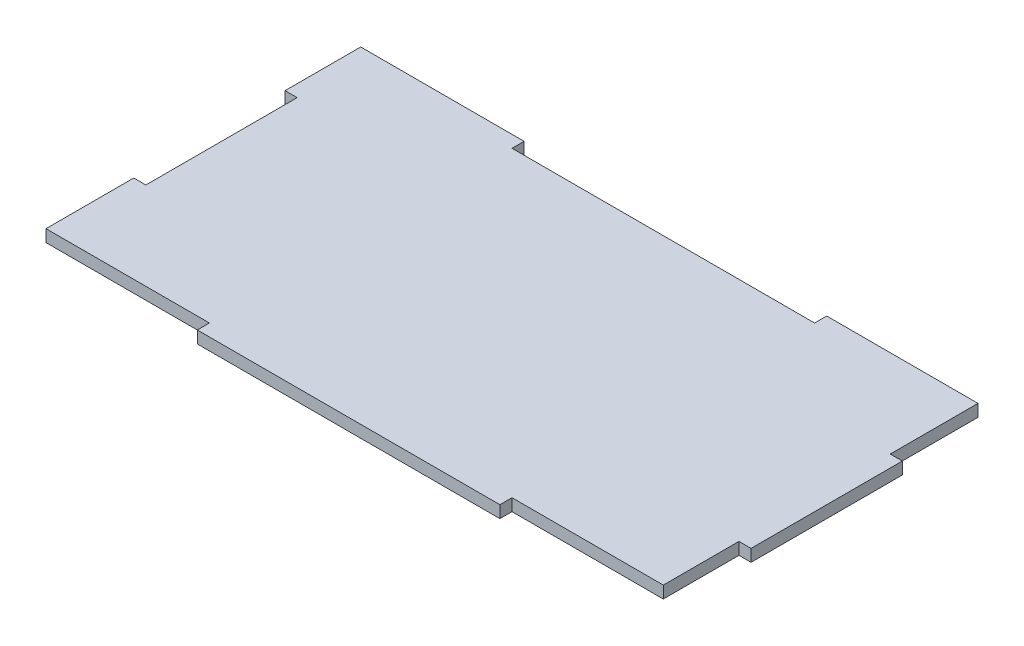
ISO-10303-21;
HEADER;
FILE_DESCRIPTION(('STEP AP214'),'2;1');
FILE_NAME('part.step','',(''),(''),'','','');
FILE_SCHEMA(('AUTOMOTIVE_DESIGN { 1 0 10303 214 1 1 1 1 }'));
ENDSEC;
DATA;
#1=APPLICATION_CONTEXT('core data for automotive mechanical design processes');
#2=APPLICATION_PROTOCOL_DEFINITION('international standard','automotive_design',2000,#1);
#3=PRODUCT_CONTEXT('',#1,'mechanical');
#4=PRODUCT('Part','Part','',(#3));
#5=PRODUCT_RELATED_PRODUCT_CATEGORY('part','',(#4));
#6=PRODUCT_DEFINITION_FORMATION('','',#4);
#7=PRODUCT_DEFINITION_CONTEXT('part definition',#1,'design');
#8=PRODUCT_DEFINITION('design','',#6,#7);
#9=PRODUCT_DEFINITION_SHAPE('','',#8);
#10=(LENGTH_UNIT() NAMED_UNIT(*) SI_UNIT(.MILLI.,.METRE.));
#11=(NAMED_UNIT(*) PLANE_ANGLE_UNIT() SI_UNIT($,.RADIAN.));
#12=(NAMED_UNIT(*) SI_UNIT($,.STERADIAN.) SOLID_ANGLE_UNIT());
#13=UNCERTAINTY_MEASURE_WITH_UNIT(LENGTH_MEASURE(1.E-05),#10,'distance_accuracy_value','');
#14=(GEOMETRIC_REPRESENTATION_CONTEXT(3) GLOBAL_UNCERTAINTY_ASSIGNED_CONTEXT((#13)) GLOBAL_UNIT_ASSIGNED_CONTEXT((#10,
#11,#12)) REPRESENTATION_CONTEXT('',''));
#15=CARTESIAN_POINT('',(0.,0.,0.));
#16=DIRECTION('',(0.,0.,1.));
#17=DIRECTION('',(1.,0.,0.));
#18=AXIS2_PLACEMENT_3D('',#15,#16,#17);
#19=CARTESIAN_POINT('',(34.2610885978316,4.,-40.2512712956719));
#20=DIRECTION('',(0.,0.,1.));
#21=DIRECTION('',(1.,0.,0.));
#22=AXIS2_PLACEMENT_3D('',#19,#20,#21);
#23=PLANE('',#22);
#24=DIRECTION('',(-1.,0.,0.));
#25=VECTOR('',#24,1.);
#26=CARTESIAN_POINT('',(34.2610885978316,0.,-40.2512712956719));
#27=LINE('',#26,#25);
#28=CARTESIAN_POINT('',(34.2610885978316,0.,-40.2512712956719));
#29=VERTEX_POINT('',#28);
#30=CARTESIAN_POINT('',(-65.7389114021684,0.,-40.2512712956719));
#31=VERTEX_POINT('',#30);
#32=EDGE_CURVE('E222',#29,#31,#27,.T.);
#33=ORIENTED_EDGE('',*,*,#32,.T.);
#34=DIRECTION('',(0.,-1.,0.));
#35=VECTOR('',#34,1.);
#36=CARTESIAN_POINT('',(-65.7389114021684,4.,-40.2512712956719));
#37=LINE('',#36,#35);
#38=CARTESIAN_POINT('',(-65.7389114021684,4.,-40.2512712956719));
#39=VERTEX_POINT('',#38);
#40=EDGE_CURVE('E11',#39,#31,#37,.T.);
#41=ORIENTED_EDGE('',*,*,#40,.F.);
#42=DIRECTION('',(-1.,0.,0.));
#43=VECTOR('',#42,1.);
#44=CARTESIAN_POINT('',(34.2610885978316,4.,-40.2512712956719));
#45=LINE('',#44,#43);
#46=CARTESIAN_POINT('',(34.2610885978316,4.,-40.2512712956719));
#47=VERTEX_POINT('',#46);
#48=EDGE_CURVE('E281',#47,#39,#45,.T.);
#49=ORIENTED_EDGE('',*,*,#48,.F.);
#50=DIRECTION('',(0.,-1.,0.));
#51=VECTOR('',#50,1.);
#52=CARTESIAN_POINT('',(34.2610885978316,4.,-40.2512712956719));
#53=LINE('',#52,#51);
#54=EDGE_CURVE('E218',#47,#29,#53,.T.);
#55=ORIENTED_EDGE('',*,*,#54,.T.);
#56=EDGE_LOOP('',(#33,#41,#49,#55));
#57=FACE_BOUND('',#56,.T.);
#58=ADVANCED_FACE('F49',(#57),#23,.F.);
#59=CARTESIAN_POINT('',(-65.7389114021684,4.,-40.2512712956719));
#60=DIRECTION('',(-1.,0.,0.));
#61=DIRECTION('',(0.,0.,1.));
#62=AXIS2_PLACEMENT_3D('',#59,#60,#61);
#63=PLANE('',#62);
#64=DIRECTION('',(0.,0.,-1.));
#65=VECTOR('',#64,1.);
#66=CARTESIAN_POINT('',(-65.7389114021684,0.,-40.2512712956719));
#67=LINE('',#66,#65);
#68=CARTESIAN_POINT('',(-65.7389114021684,0.,-44.2512712956719));
#69=VERTEX_POINT('',#68);
#70=EDGE_CURVE('E226',#31,#69,#67,.T.);
#71=ORIENTED_EDGE('',*,*,#70,.T.);
#72=DIRECTION('',(0.,-1.,0.));
#73=VECTOR('',#72,1.);
#74=CARTESIAN_POINT('',(-65.7389114021684,4.,-44.2512712956719));
#75=LINE('',#74,#73);
#76=CARTESIAN_POINT('',(-65.7389114021684,4.,-44.2512712956719));
#77=VERTEX_POINT('',#76);
#78=EDGE_CURVE('E58',#77,#69,#75,.T.);
#79=ORIENTED_EDGE('',*,*,#78,.F.);
#80=DIRECTION('',(0.,0.,-1.));
#81=VECTOR('',#80,1.);
#82=CARTESIAN_POINT('',(-65.7389114021684,4.,-40.2512712956719));
#83=LINE('',#82,#81);
#84=EDGE_CURVE('E145',#39,#77,#83,.T.);
#85=ORIENTED_EDGE('',*,*,#84,.F.);
#86=ORIENTED_EDGE('',*,*,#40,.T.);
#87=EDGE_LOOP('',(#71,#79,#85,#86));
#88=FACE_BOUND('',#87,.T.);
#89=ADVANCED_FACE('F431',(#88),#63,.F.);
#90=CARTESIAN_POINT('',(-65.7389114021684,4.,-44.2512712956719));
#91=DIRECTION('',(0.,0.,1.));
#92=DIRECTION('',(1.,0.,0.));
#93=AXIS2_PLACEMENT_3D('',#90,#91,#92);
#94=PLANE('',#93);
#95=DIRECTION('',(-1.,0.,0.));
#96=VECTOR('',#95,1.);
#97=CARTESIAN_POINT('',(-65.7389114021684,0.,-44.2512712956719));
#98=LINE('',#97,#96);
#99=CARTESIAN_POINT('',(-119.738911402168,0.,-44.2512712956719));
#100=VERTEX_POINT('',#99);
#101=EDGE_CURVE('E229',#69,#100,#98,.T.);
#102=ORIENTED_EDGE('',*,*,#101,.T.);
#103=DIRECTION('',(0.,-1.,0.));
#104=VECTOR('',#103,1.);
#105=CARTESIAN_POINT('',(-119.738911402168,4.,-44.2512712956719));
#106=LINE('',#105,#104);
#107=CARTESIAN_POINT('',(-119.738911402168,4.,-44.2512712956719));
#108=VERTEX_POINT('',#107);
#109=EDGE_CURVE('E340',#108,#100,#106,.T.);
#110=ORIENTED_EDGE('',*,*,#109,.F.);
#111=DIRECTION('',(-1.,0.,0.));
#112=VECTOR('',#111,1.);
#113=CARTESIAN_POINT('',(-65.7389114021684,4.,-44.2512712956719));
#114=LINE('',#113,#112);
#115=EDGE_CURVE('E350',#77,#108,#114,.T.);
#116=ORIENTED_EDGE('',*,*,#115,.F.);
#117=ORIENTED_EDGE('',*,*,#78,.T.);
#118=EDGE_LOOP('',(#102,#110,#116,#117));
#119=FACE_BOUND('',#118,.T.);
#120=ADVANCED_FACE('F348',(#119),#94,.F.);
#121=CARTESIAN_POINT('',(-119.738911402168,4.,-44.2512712956719));
#122=DIRECTION('',(1.,0.,0.));
#123=DIRECTION('',(0.,0.,-1.));
#124=AXIS2_PLACEMENT_3D('',#121,#122,#123);
#125=PLANE('',#124);
#126=DIRECTION('',(0.,0.,1.));
#127=VECTOR('',#126,1.);
#128=CARTESIAN_POINT('',(-119.738911402168,0.,-44.2512712956719));
#129=LINE('',#128,#127);
#130=CARTESIAN_POINT('',(-119.738911402168,0.,-19.2512712956718));
#131=VERTEX_POINT('',#130);
#132=EDGE_CURVE('E232',#100,#131,#129,.T.);
#133=ORIENTED_EDGE('',*,*,#132,.T.);
#134=DIRECTION('',(0.,-1.,0.));
#135=VECTOR('',#134,1.);
#136=CARTESIAN_POINT('',(-119.738911402168,4.,-19.2512712956718));
#137=LINE('',#136,#135);
#138=CARTESIAN_POINT('',(-119.738911402168,4.,-19.2512712956718));
#139=VERTEX_POINT('',#138);
#140=EDGE_CURVE('E336',#139,#131,#137,.T.);
#141=ORIENTED_EDGE('',*,*,#140,.F.);
#142=DIRECTION('',(0.,0.,1.));
#143=VECTOR('',#142,1.);
#144=CARTESIAN_POINT('',(-119.738911402168,4.,-44.2512712956719));
#145=LINE('',#144,#143);
#146=EDGE_CURVE('E369',#108,#139,#145,.T.);
#147=ORIENTED_EDGE('',*,*,#146,.F.);
#148=ORIENTED_EDGE('',*,*,#109,.T.);
#149=EDGE_LOOP('',(#133,#141,#147,#148));
#150=FACE_BOUND('',#149,.T.);
#151=ADVANCED_FACE('F359',(#150),#125,.F.);
#152=CARTESIAN_POINT('',(-119.738911402168,4.,-19.2512712956718));
#153=DIRECTION('',(0.,0.,-1.));
#154=DIRECTION('',(-1.,0.,0.));
#155=AXIS2_PLACEMENT_3D('',#152,#153,#154);
#156=PLANE('',#155);
#157=DIRECTION('',(1.,0.,0.));
#158=VECTOR('',#157,1.);
#159=CARTESIAN_POINT('',(-119.738911402168,0.,-19.2512712956718));
#160=LINE('',#159,#158);
#161=CARTESIAN_POINT('',(-115.738911402168,0.,-19.2512712956718));
#162=VERTEX_POINT('',#161);
#163=EDGE_CURVE('E235',#131,#162,#160,.T.);
#164=ORIENTED_EDGE('',*,*,#163,.T.);
#165=DIRECTION('',(0.,-1.,0.));
#166=VECTOR('',#165,1.);
#167=CARTESIAN_POINT('',(-115.738911402168,4.,-19.2512712956718));
#168=LINE('',#167,#166);
#169=CARTESIAN_POINT('',(-115.738911402168,4.,-19.2512712956718));
#170=VERTEX_POINT('',#169);
#171=EDGE_CURVE('E332',#170,#162,#168,.T.);
#172=ORIENTED_EDGE('',*,*,#171,.F.);
#173=DIRECTION('',(1.,0.,0.));
#174=VECTOR('',#173,1.);
#175=CARTESIAN_POINT('',(-119.738911402168,4.,-19.2512712956718));
#176=LINE('',#175,#174);
#177=EDGE_CURVE('E365',#139,#170,#176,.T.);
#178=ORIENTED_EDGE('',*,*,#177,.F.);
#179=ORIENTED_EDGE('',*,*,#140,.T.);
#180=EDGE_LOOP('',(#164,#172,#178,#179));
#181=FACE_BOUND('',#180,.T.);
#182=ADVANCED_FACE('F363',(#181),#156,.F.);
#183=CARTESIAN_POINT('',(-115.738911402168,4.,-19.2512712956718));
#184=DIRECTION('',(1.,0.,0.));
#185=DIRECTION('',(0.,0.,-1.));
#186=AXIS2_PLACEMENT_3D('',#183,#184,#185);
#187=PLANE('',#186);
#188=DIRECTION('',(0.,0.,1.));
#189=VECTOR('',#188,1.);
#190=CARTESIAN_POINT('',(-115.738911402168,0.,-19.2512712956718));
#191=LINE('',#190,#189);
#192=CARTESIAN_POINT('',(-115.738911402168,0.,30.7487287043282));
#193=VERTEX_POINT('',#192);
#194=EDGE_CURVE('E238',#162,#193,#191,.T.);
#195=ORIENTED_EDGE('',*,*,#194,.T.);
#196=DIRECTION('',(0.,-1.,0.));
#197=VECTOR('',#196,1.);
#198=CARTESIAN_POINT('',(-115.738911402168,4.,30.7487287043282));
#199=LINE('',#198,#197);
#200=CARTESIAN_POINT('',(-115.738911402168,4.,30.7487287043282));
#201=VERTEX_POINT('',#200);
#202=EDGE_CURVE('E328',#201,#193,#199,.T.);
#203=ORIENTED_EDGE('',*,*,#202,.F.);
#204=DIRECTION('',(0.,0.,1.));
#205=VECTOR('',#204,1.);
#206=CARTESIAN_POINT('',(-115.738911402168,4.,-19.2512712956718));
#207=LINE('',#206,#205);
#208=EDGE_CURVE('E368',#170,#201,#207,.T.);
#209=ORIENTED_EDGE('',*,*,#208,.F.);
#210=ORIENTED_EDGE('',*,*,#171,.T.);
#211=EDGE_LOOP('',(#195,#203,#209,#210));
#212=FACE_BOUND('',#211,.T.);
#213=ADVANCED_FACE('F444',(#212),#187,.F.);
#214=CARTESIAN_POINT('',(-115.738911402168,4.,30.7487287043282));
#215=DIRECTION('',(0.,0.,1.));
#216=DIRECTION('',(1.,0.,0.));
#217=AXIS2_PLACEMENT_3D('',#214,#215,#216);
#218=PLANE('',#217);
#219=DIRECTION('',(-1.,0.,0.));
#220=VECTOR('',#219,1.);
#221=CARTESIAN_POINT('',(-115.738911402168,0.,30.7487287043282));
#222=LINE('',#221,#220);
#223=CARTESIAN_POINT('',(-119.738911402168,0.,30.7487287043282));
#224=VERTEX_POINT('',#223);
#225=EDGE_CURVE('E241',#193,#224,#222,.T.);
#226=ORIENTED_EDGE('',*,*,#225,.T.);
#227=DIRECTION('',(0.,-1.,0.));
#228=VECTOR('',#227,1.);
#229=CARTESIAN_POINT('',(-119.738911402168,4.,30.7487287043282));
#230=LINE('',#229,#228);
#231=CARTESIAN_POINT('',(-119.738911402168,4.,30.7487287043282));
#232=VERTEX_POINT('',#231);
#233=EDGE_CURVE('E324',#232,#224,#230,.T.);
#234=ORIENTED_EDGE('',*,*,#233,.F.);
#235=DIRECTION('',(-1.,0.,0.));
#236=VECTOR('',#235,1.);
#237=CARTESIAN_POINT('',(-115.738911402168,4.,30.7487287043282));
#238=LINE('',#237,#236);
#239=EDGE_CURVE('E373',#201,#232,#238,.T.);
#240=ORIENTED_EDGE('',*,*,#239,.F.);
#241=ORIENTED_EDGE('',*,*,#202,.T.);
#242=EDGE_LOOP('',(#226,#234,#240,#241));
#243=FACE_BOUND('',#242,.T.);
#244=ADVANCED_FACE('F447',(#243),#218,.F.);
#245=CARTESIAN_POINT('',(-119.738911402168,4.,30.7487287043282));
#246=DIRECTION('',(1.,0.,0.));
#247=DIRECTION('',(0.,0.,-1.));
#248=AXIS2_PLACEMENT_3D('',#245,#246,#247);
#249=PLANE('',#248);
#250=DIRECTION('',(0.,0.,1.));
#251=VECTOR('',#250,1.);
#252=CARTESIAN_POINT('',(-119.738911402168,0.,30.7487287043282));
#253=LINE('',#252,#251);
#254=CARTESIAN_POINT('',(-119.738911402168,0.,59.7487287043281));
#255=VERTEX_POINT('',#254);
#256=EDGE_CURVE('E244',#224,#255,#253,.T.);
#257=ORIENTED_EDGE('',*,*,#256,.T.);
#258=DIRECTION('',(0.,-1.,0.));
#259=VECTOR('',#258,1.);
#260=CARTESIAN_POINT('',(-119.738911402168,4.,59.7487287043281));
#261=LINE('',#260,#259);
#262=CARTESIAN_POINT('',(-119.738911402168,4.,59.7487287043281));
#263=VERTEX_POINT('',#262);
#264=EDGE_CURVE('E320',#263,#255,#261,.T.);
#265=ORIENTED_EDGE('',*,*,#264,.F.);
#266=DIRECTION('',(0.,0.,1.));
#267=VECTOR('',#266,1.);
#268=CARTESIAN_POINT('',(-119.738911402168,4.,30.7487287043282));
#269=LINE('',#268,#267);
#270=EDGE_CURVE('E380',#232,#263,#269,.T.);
#271=ORIENTED_EDGE('',*,*,#270,.F.);
#272=ORIENTED_EDGE('',*,*,#233,.T.);
#273=EDGE_LOOP('',(#257,#265,#271,#272));
#274=FACE_BOUND('',#273,.T.);
#275=ADVANCED_FACE('F451',(#274),#249,.F.);
#276=CARTESIAN_POINT('',(-115.738911402168,4.,59.7487287043281));
#277=DIRECTION('',(0.,0.,-1.));
#278=DIRECTION('',(-1.,0.,0.));
#279=AXIS2_PLACEMENT_3D('',#276,#277,#278);
#280=PLANE('',#279);
#281=DIRECTION('',(1.,0.,0.));
#282=VECTOR('',#281,1.);
#283=CARTESIAN_POINT('',(-115.738911402168,0.,59.7487287043281));
#284=LINE('',#283,#282);
#285=CARTESIAN_POINT('',(-65.7389114021684,0.,59.7487287043281));
#286=VERTEX_POINT('',#285);
#287=EDGE_CURVE('E248',#255,#286,#284,.T.);
#288=ORIENTED_EDGE('',*,*,#287,.T.);
#289=DIRECTION('',(0.,-1.,0.));
#290=VECTOR('',#289,1.);
#291=CARTESIAN_POINT('',(-65.7389114021684,4.,59.7487287043281));
#292=LINE('',#291,#290);
#293=CARTESIAN_POINT('',(-65.7389114021684,4.,59.7487287043281));
#294=VERTEX_POINT('',#293);
#295=EDGE_CURVE('E316',#294,#286,#292,.T.);
#296=ORIENTED_EDGE('',*,*,#295,.F.);
#297=DIRECTION('',(1.,0.,0.));
#298=VECTOR('',#297,1.);
#299=CARTESIAN_POINT('',(-119.738911402168,4.,59.7487287043281));
#300=LINE('',#299,#298);
#301=EDGE_CURVE('E383',#263,#294,#300,.T.);
#302=ORIENTED_EDGE('',*,*,#301,.F.);
#303=ORIENTED_EDGE('',*,*,#264,.T.);
#304=EDGE_LOOP('',(#288,#296,#302,#303));
#305=FACE_BOUND('',#304,.T.);
#306=ADVANCED_FACE('F455',(#305),#280,.F.);
#307=CARTESIAN_POINT('',(-65.7389114021684,4.,59.7487287043281));
#308=DIRECTION('',(1.,0.,0.));
#309=DIRECTION('',(0.,0.,-1.));
#310=AXIS2_PLACEMENT_3D('',#307,#308,#309);
#311=PLANE('',#310);
#312=DIRECTION('',(0.,0.,1.));
#313=VECTOR('',#312,1.);
#314=CARTESIAN_POINT('',(-65.7389114021684,0.,59.7487287043281));
#315=LINE('',#314,#313);
#316=CARTESIAN_POINT('',(-65.7389114021684,0.,63.7487287043281));
#317=VERTEX_POINT('',#316);
#318=EDGE_CURVE('E251',#286,#317,#315,.T.);
#319=ORIENTED_EDGE('',*,*,#318,.T.);
#320=DIRECTION('',(0.,-1.,0.));
#321=VECTOR('',#320,1.);
#322=CARTESIAN_POINT('',(-65.7389114021684,4.,63.7487287043281));
#323=LINE('',#322,#321);
#324=CARTESIAN_POINT('',(-65.7389114021684,4.,63.7487287043281));
#325=VERTEX_POINT('',#324);
#326=EDGE_CURVE('E312',#325,#317,#323,.T.);
#327=ORIENTED_EDGE('',*,*,#326,.F.);
#328=DIRECTION('',(0.,0.,1.));
#329=VECTOR('',#328,1.);
#330=CARTESIAN_POINT('',(-65.7389114021684,4.,59.7487287043281));
#331=LINE('',#330,#329);
#332=EDGE_CURVE('E386',#294,#325,#331,.T.);
#333=ORIENTED_EDGE('',*,*,#332,.F.);
#334=ORIENTED_EDGE('',*,*,#295,.T.);
#335=EDGE_LOOP('',(#319,#327,#333,#334));
#336=FACE_BOUND('',#335,.T.);
#337=ADVANCED_FACE('F459',(#336),#311,.F.);
#338=CARTESIAN_POINT('',(-65.7389114021684,4.,63.7487287043281));
#339=DIRECTION('',(0.,0.,-1.));
#340=DIRECTION('',(-1.,0.,0.));
#341=AXIS2_PLACEMENT_3D('',#338,#339,#340);
#342=PLANE('',#341);
#343=DIRECTION('',(1.,0.,0.));
#344=VECTOR('',#343,1.);
#345=CARTESIAN_POINT('',(-65.7389114021684,0.,63.7487287043281));
#346=LINE('',#345,#344);
#347=CARTESIAN_POINT('',(34.2610885978316,0.,63.7487287043281));
#348=VERTEX_POINT('',#347);
#349=EDGE_CURVE('E254',#317,#348,#346,.T.);
#350=ORIENTED_EDGE('',*,*,#349,.T.);
#351=DIRECTION('',(0.,-1.,0.));
#352=VECTOR('',#351,1.);
#353=CARTESIAN_POINT('',(34.2610885978316,4.,63.7487287043281));
#354=LINE('',#353,#352);
#355=CARTESIAN_POINT('',(34.2610885978316,4.,63.7487287043281));
#356=VERTEX_POINT('',#355);
#357=EDGE_CURVE('E308',#356,#348,#354,.T.);
#358=ORIENTED_EDGE('',*,*,#357,.F.);
#359=DIRECTION('',(1.,0.,0.));
#360=VECTOR('',#359,1.);
#361=CARTESIAN_POINT('',(-65.7389114021684,4.,63.7487287043281));
#362=LINE('',#361,#360);
#363=EDGE_CURVE('E389',#325,#356,#362,.T.);
#364=ORIENTED_EDGE('',*,*,#363,.F.);
#365=ORIENTED_EDGE('',*,*,#326,.T.);
#366=EDGE_LOOP('',(#350,#358,#364,#365));
#367=FACE_BOUND('',#366,.T.);
#368=ADVANCED_FACE('F463',(#367),#342,.F.);
#369=CARTESIAN_POINT('',(34.2610885978316,4.,63.7487287043281));
#370=DIRECTION('',(-1.,0.,0.));
#371=DIRECTION('',(0.,0.,1.));
#372=AXIS2_PLACEMENT_3D('',#369,#370,#371);
#373=PLANE('',#372);
#374=DIRECTION('',(0.,0.,-1.));
#375=VECTOR('',#374,1.);
#376=CARTESIAN_POINT('',(34.2610885978316,0.,63.7487287043281));
#377=LINE('',#376,#375);
#378=CARTESIAN_POINT('',(34.2610885978316,0.,59.7487287043281));
#379=VERTEX_POINT('',#378);
#380=EDGE_CURVE('E257',#348,#379,#377,.T.);
#381=ORIENTED_EDGE('',*,*,#380,.T.);
#382=DIRECTION('',(0.,-1.,0.));
#383=VECTOR('',#382,1.);
#384=CARTESIAN_POINT('',(34.2610885978316,4.,59.7487287043281));
#385=LINE('',#384,#383);
#386=CARTESIAN_POINT('',(34.2610885978316,4.,59.7487287043281));
#387=VERTEX_POINT('',#386);
#388=EDGE_CURVE('E304',#387,#379,#385,.T.);
#389=ORIENTED_EDGE('',*,*,#388,.F.);
#390=DIRECTION('',(0.,0.,-1.));
#391=VECTOR('',#390,1.);
#392=CARTESIAN_POINT('',(34.2610885978316,4.,63.7487287043281));
#393=LINE('',#392,#391);
#394=EDGE_CURVE('E392',#356,#387,#393,.T.);
#395=ORIENTED_EDGE('',*,*,#394,.F.);
#396=ORIENTED_EDGE('',*,*,#357,.T.);
#397=EDGE_LOOP('',(#381,#389,#395,#396));
#398=FACE_BOUND('',#397,.T.);
#399=ADVANCED_FACE('F467',(#398),#373,.F.);
#400=CARTESIAN_POINT('',(34.2610885978316,4.,59.7487287043281));
#401=DIRECTION('',(0.,0.,-1.));
#402=DIRECTION('',(-1.,0.,0.));
#403=AXIS2_PLACEMENT_3D('',#400,#401,#402);
#404=PLANE('',#403);
#405=DIRECTION('',(1.,0.,0.));
#406=VECTOR('',#405,1.);
#407=CARTESIAN_POINT('',(34.2610885978316,0.,59.7487287043281));
#408=LINE('',#407,#406);
#409=CARTESIAN_POINT('',(84.2610885978317,0.,59.7487287043281));
#410=VERTEX_POINT('',#409);
#411=EDGE_CURVE('E260',#379,#410,#408,.T.);
#412=ORIENTED_EDGE('',*,*,#411,.T.);
#413=DIRECTION('',(0.,-1.,0.));
#414=VECTOR('',#413,1.);
#415=CARTESIAN_POINT('',(84.2610885978317,4.,59.7487287043281));
#416=LINE('',#415,#414);
#417=CARTESIAN_POINT('',(84.2610885978317,4.,59.7487287043281));
#418=VERTEX_POINT('',#417);
#419=EDGE_CURVE('E300',#418,#410,#416,.T.);
#420=ORIENTED_EDGE('',*,*,#419,.F.);
#421=DIRECTION('',(1.,0.,0.));
#422=VECTOR('',#421,1.);
#423=CARTESIAN_POINT('',(34.2610885978316,4.,59.7487287043281));
#424=LINE('',#423,#422);
#425=EDGE_CURVE('E395',#387,#418,#424,.T.);
#426=ORIENTED_EDGE('',*,*,#425,.F.);
#427=ORIENTED_EDGE('',*,*,#388,.T.);
#428=EDGE_LOOP('',(#412,#420,#426,#427));
#429=FACE_BOUND('',#428,.T.);
#430=ADVANCED_FACE('F471',(#429),#404,.F.);
#431=CARTESIAN_POINT('',(84.2610885978317,4.,59.7487287043281));
#432=DIRECTION('',(-1.,0.,0.));
#433=DIRECTION('',(0.,0.,1.));
#434=AXIS2_PLACEMENT_3D('',#431,#432,#433);
#435=PLANE('',#434);
#436=DIRECTION('',(0.,0.,-1.));
#437=VECTOR('',#436,1.);
#438=CARTESIAN_POINT('',(84.2610885978317,0.,59.7487287043281));
#439=LINE('',#438,#437);
#440=CARTESIAN_POINT('',(84.2610885978317,0.,34.7487287043281));
#441=VERTEX_POINT('',#440);
#442=EDGE_CURVE('E263',#410,#441,#439,.T.);
#443=ORIENTED_EDGE('',*,*,#442,.T.);
#444=DIRECTION('',(0.,-1.,0.));
#445=VECTOR('',#444,1.);
#446=CARTESIAN_POINT('',(84.2610885978317,4.,34.7487287043281));
#447=LINE('',#446,#445);
#448=CARTESIAN_POINT('',(84.2610885978317,4.,34.7487287043281));
#449=VERTEX_POINT('',#448);
#450=EDGE_CURVE('E296',#449,#441,#447,.T.);
#451=ORIENTED_EDGE('',*,*,#450,.F.);
#452=DIRECTION('',(0.,0.,-1.));
#453=VECTOR('',#452,1.);
#454=CARTESIAN_POINT('',(84.2610885978317,4.,59.7487287043281));
#455=LINE('',#454,#453);
#456=EDGE_CURVE('E398',#418,#449,#455,.T.);
#457=ORIENTED_EDGE('',*,*,#456,.F.);
#458=ORIENTED_EDGE('',*,*,#419,.T.);
#459=EDGE_LOOP('',(#443,#451,#457,#458));
#460=FACE_BOUND('',#459,.T.);
#461=ADVANCED_FACE('F475',(#460),#435,.F.);
#462=CARTESIAN_POINT('',(84.2610885978317,4.,34.7487287043281));
#463=DIRECTION('',(0.,0.,-1.));
#464=DIRECTION('',(-1.,0.,0.));
#465=AXIS2_PLACEMENT_3D('',#462,#463,#464);
#466=PLANE('',#465);
#467=DIRECTION('',(1.,0.,0.));
#468=VECTOR('',#467,1.);
#469=CARTESIAN_POINT('',(84.2610885978317,0.,34.7487287043281));
#470=LINE('',#469,#468);
#471=CARTESIAN_POINT('',(88.2610885978317,0.,34.7487287043281));
#472=VERTEX_POINT('',#471);
#473=EDGE_CURVE('E266',#441,#472,#470,.T.);
#474=ORIENTED_EDGE('',*,*,#473,.T.);
#475=DIRECTION('',(0.,-1.,0.));
#476=VECTOR('',#475,1.);
#477=CARTESIAN_POINT('',(88.2610885978317,4.,34.7487287043281));
#478=LINE('',#477,#476);
#479=CARTESIAN_POINT('',(88.2610885978317,4.,34.7487287043281));
#480=VERTEX_POINT('',#479);
#481=EDGE_CURVE('E292',#480,#472,#478,.T.);
#482=ORIENTED_EDGE('',*,*,#481,.F.);
#483=DIRECTION('',(1.,0.,0.));
#484=VECTOR('',#483,1.);
#485=CARTESIAN_POINT('',(84.2610885978317,4.,34.7487287043281));
#486=LINE('',#485,#484);
#487=EDGE_CURVE('E401',#449,#480,#486,.T.);
#488=ORIENTED_EDGE('',*,*,#487,.F.);
#489=ORIENTED_EDGE('',*,*,#450,.T.);
#490=EDGE_LOOP('',(#474,#482,#488,#489));
#491=FACE_BOUND('',#490,.T.);
#492=ADVANCED_FACE('F479',(#491),#466,.F.);
#493=CARTESIAN_POINT('',(88.2610885978317,4.,34.7487287043281));
#494=DIRECTION('',(-1.,0.,0.));
#495=DIRECTION('',(0.,0.,1.));
#496=AXIS2_PLACEMENT_3D('',#493,#494,#495);
#497=PLANE('',#496);
#498=DIRECTION('',(0.,0.,-1.));
#499=VECTOR('',#498,1.);
#500=CARTESIAN_POINT('',(88.2610885978317,0.,34.7487287043281));
#501=LINE('',#500,#499);
#502=CARTESIAN_POINT('',(88.2610885978317,0.,-15.2512712956719));
#503=VERTEX_POINT('',#502);
#504=EDGE_CURVE('E269',#472,#503,#501,.T.);
#505=ORIENTED_EDGE('',*,*,#504,.T.);
#506=DIRECTION('',(0.,-1.,0.));
#507=VECTOR('',#506,1.);
#508=CARTESIAN_POINT('',(88.2610885978317,4.,-15.2512712956719));
#509=LINE('',#508,#507);
#510=CARTESIAN_POINT('',(88.2610885978317,4.,-15.2512712956719));
#511=VERTEX_POINT('',#510);
#512=EDGE_CURVE('E288',#511,#503,#509,.T.);
#513=ORIENTED_EDGE('',*,*,#512,.F.);
#514=DIRECTION('',(0.,0.,-1.));
#515=VECTOR('',#514,1.);
#516=CARTESIAN_POINT('',(88.2610885978317,4.,34.7487287043281));
#517=LINE('',#516,#515);
#518=EDGE_CURVE('E404',#480,#511,#517,.T.);
#519=ORIENTED_EDGE('',*,*,#518,.F.);
#520=ORIENTED_EDGE('',*,*,#481,.T.);
#521=EDGE_LOOP('',(#505,#513,#519,#520));
#522=FACE_BOUND('',#521,.T.);
#523=ADVANCED_FACE('F412',(#522),#497,.F.);
#524=CARTESIAN_POINT('',(88.2610885978317,4.,-15.2512712956719));
#525=DIRECTION('',(0.,0.,1.));
#526=DIRECTION('',(1.,0.,0.));
#527=AXIS2_PLACEMENT_3D('',#524,#525,#526);
#528=PLANE('',#527);
#529=DIRECTION('',(-1.,0.,0.));
#530=VECTOR('',#529,1.);
#531=CARTESIAN_POINT('',(88.2610885978317,0.,-15.2512712956719));
#532=LINE('',#531,#530);
#533=CARTESIAN_POINT('',(84.2610885978317,0.,-15.2512712956719));
#534=VERTEX_POINT('',#533);
#535=EDGE_CURVE('E272',#503,#534,#532,.T.);
#536=ORIENTED_EDGE('',*,*,#535,.T.);
#537=DIRECTION('',(0.,-1.,0.));
#538=VECTOR('',#537,1.);
#539=CARTESIAN_POINT('',(84.2610885978317,4.,-15.2512712956719));
#540=LINE('',#539,#538);
#541=CARTESIAN_POINT('',(84.2610885978317,4.,-15.2512712956719));
#542=VERTEX_POINT('',#541);
#543=EDGE_CURVE('E211',#542,#534,#540,.T.);
#544=ORIENTED_EDGE('',*,*,#543,.F.);
#545=DIRECTION('',(-1.,0.,0.));
#546=VECTOR('',#545,1.);
#547=CARTESIAN_POINT('',(88.2610885978317,4.,-15.2512712956719));
#548=LINE('',#547,#546);
#549=EDGE_CURVE('E200',#511,#542,#548,.T.);
#550=ORIENTED_EDGE('',*,*,#549,.F.);
#551=ORIENTED_EDGE('',*,*,#512,.T.);
#552=EDGE_LOOP('',(#536,#544,#550,#551));
#553=FACE_BOUND('',#552,.T.);
#554=ADVANCED_FACE('F416',(#553),#528,.F.);
#555=CARTESIAN_POINT('',(84.2610885978317,4.,-15.2512712956719));
#556=DIRECTION('',(-1.,0.,0.));
#557=DIRECTION('',(0.,0.,1.));
#558=AXIS2_PLACEMENT_3D('',#555,#556,#557);
#559=PLANE('',#558);
#560=DIRECTION('',(0.,0.,-1.));
#561=VECTOR('',#560,1.);
#562=CARTESIAN_POINT('',(84.2610885978317,0.,-15.2512712956719));
#563=LINE('',#562,#561);
#564=CARTESIAN_POINT('',(84.2610885978317,0.,-44.2512712956719));
#565=VERTEX_POINT('',#564);
#566=EDGE_CURVE('E209',#534,#565,#563,.T.);
#567=ORIENTED_EDGE('',*,*,#566,.T.);
#568=DIRECTION('',(0.,-1.,0.));
#569=VECTOR('',#568,1.);
#570=CARTESIAN_POINT('',(84.2610885978317,4.,-44.2512712956719));
#571=LINE('',#570,#569);
#572=CARTESIAN_POINT('',(84.2610885978317,4.,-44.2512712956719));
#573=VERTEX_POINT('',#572);
#574=EDGE_CURVE('E206',#573,#565,#571,.T.);
#575=ORIENTED_EDGE('',*,*,#574,.F.);
#576=DIRECTION('',(0.,0.,-1.));
#577=VECTOR('',#576,1.);
#578=CARTESIAN_POINT('',(84.2610885978317,4.,-15.2512712956719));
#579=LINE('',#578,#577);
#580=EDGE_CURVE('E194',#542,#573,#579,.T.);
#581=ORIENTED_EDGE('',*,*,#580,.F.);
#582=ORIENTED_EDGE('',*,*,#543,.T.);
#583=EDGE_LOOP('',(#567,#575,#581,#582));
#584=FACE_BOUND('',#583,.T.);
#585=ADVANCED_FACE('F207',(#584),#559,.F.);
#586=CARTESIAN_POINT('',(84.2610885978317,4.,-44.2512712956719));
#587=DIRECTION('',(0.,0.,1.));
#588=DIRECTION('',(1.,0.,0.));
#589=AXIS2_PLACEMENT_3D('',#586,#587,#588);
#590=PLANE('',#589);
#591=DIRECTION('',(-1.,0.,0.));
#592=VECTOR('',#591,1.);
#593=CARTESIAN_POINT('',(84.2610885978317,0.,-44.2512712956719));
#594=LINE('',#593,#592);
#595=CARTESIAN_POINT('',(34.2610885978316,0.,-44.2512712956719));
#596=VERTEX_POINT('',#595);
#597=EDGE_CURVE('E131',#565,#596,#594,.T.);
#598=ORIENTED_EDGE('',*,*,#597,.T.);
#599=DIRECTION('',(0.,-1.,0.));
#600=VECTOR('',#599,1.);
#601=CARTESIAN_POINT('',(34.2610885978316,4.,-44.2512712956719));
#602=LINE('',#601,#600);
#603=CARTESIAN_POINT('',(34.2610885978316,4.,-44.2512712956719));
#604=VERTEX_POINT('',#603);
#605=EDGE_CURVE('E212',#604,#596,#602,.T.);
#606=ORIENTED_EDGE('',*,*,#605,.F.);
#607=DIRECTION('',(-1.,0.,0.));
#608=VECTOR('',#607,1.);
#609=CARTESIAN_POINT('',(84.2610885978317,4.,-44.2512712956719));
#610=LINE('',#609,#608);
#611=EDGE_CURVE('E198',#573,#604,#610,.T.);
#612=ORIENTED_EDGE('',*,*,#611,.F.);
#613=ORIENTED_EDGE('',*,*,#574,.T.);
#614=EDGE_LOOP('',(#598,#606,#612,#613));
#615=FACE_BOUND('',#614,.T.);
#616=ADVANCED_FACE('F214',(#615),#590,.F.);
#617=CARTESIAN_POINT('',(34.2610885978316,4.,-44.2512712956719));
#618=DIRECTION('',(1.,0.,0.));
#619=DIRECTION('',(0.,0.,-1.));
#620=AXIS2_PLACEMENT_3D('',#617,#618,#619);
#621=PLANE('',#620);
#622=DIRECTION('',(0.,0.,1.));
#623=VECTOR('',#622,1.);
#624=CARTESIAN_POINT('',(34.2610885978316,0.,-44.2512712956719));
#625=LINE('',#624,#623);
#626=EDGE_CURVE('E137',#596,#29,#625,.T.);
#627=ORIENTED_EDGE('',*,*,#626,.T.);
#628=ORIENTED_EDGE('',*,*,#54,.F.);
#629=DIRECTION('',(0.,0.,1.));
#630=VECTOR('',#629,1.);
#631=CARTESIAN_POINT('',(34.2610885978316,4.,-44.2512712956719));
#632=LINE('',#631,#630);
#633=EDGE_CURVE('E66',#604,#47,#632,.T.);
#634=ORIENTED_EDGE('',*,*,#633,.F.);
#635=ORIENTED_EDGE('',*,*,#605,.T.);
#636=EDGE_LOOP('',(#627,#628,#634,#635));
#637=FACE_BOUND('',#636,.T.);
#638=ADVANCED_FACE('F420',(#637),#621,.F.);
#639=CARTESIAN_POINT('',(0.,4.,0.));
#640=DIRECTION('',(0.,-1.,0.));
#641=DIRECTION('',(0.,0.,-1.));
#642=AXIS2_PLACEMENT_3D('',#639,#640,#641);
#643=PLANE('',#642);
#644=ORIENTED_EDGE('',*,*,#48,.T.);
#645=ORIENTED_EDGE('',*,*,#84,.T.);
#646=ORIENTED_EDGE('',*,*,#115,.T.);
#647=ORIENTED_EDGE('',*,*,#146,.T.);
#648=ORIENTED_EDGE('',*,*,#177,.T.);
#649=ORIENTED_EDGE('',*,*,#208,.T.);
#650=ORIENTED_EDGE('',*,*,#239,.T.);
#651=ORIENTED_EDGE('',*,*,#270,.T.);
#652=ORIENTED_EDGE('',*,*,#301,.T.);
#653=ORIENTED_EDGE('',*,*,#332,.T.);
#654=ORIENTED_EDGE('',*,*,#363,.T.);
#655=ORIENTED_EDGE('',*,*,#394,.T.);
#656=ORIENTED_EDGE('',*,*,#425,.T.);
#657=ORIENTED_EDGE('',*,*,#456,.T.);
#658=ORIENTED_EDGE('',*,*,#487,.T.);
#659=ORIENTED_EDGE('',*,*,#518,.T.);
#660=ORIENTED_EDGE('',*,*,#549,.T.);
#661=ORIENTED_EDGE('',*,*,#580,.T.);
#662=ORIENTED_EDGE('',*,*,#611,.T.);
#663=ORIENTED_EDGE('',*,*,#633,.T.);
#664=EDGE_LOOP('',(#644,#645,#646,#647,#648,#649,#650,#651,#652,#653,#654,#655,#656,#657,#658,
#659,#660,#661,#662,#663));
#665=FACE_BOUND('',#664,.T.);
#666=ADVANCED_FACE('F196',(#665),#643,.F.);
#667=CARTESIAN_POINT('',(0.,0.,0.));
#668=DIRECTION('',(0.,-1.,0.));
#669=DIRECTION('',(0.,0.,-1.));
#670=AXIS2_PLACEMENT_3D('',#667,#668,#669);
#671=PLANE('',#670);
#672=ORIENTED_EDGE('',*,*,#32,.F.);
#673=ORIENTED_EDGE('',*,*,#626,.F.);
#674=ORIENTED_EDGE('',*,*,#597,.F.);
#675=ORIENTED_EDGE('',*,*,#566,.F.);
#676=ORIENTED_EDGE('',*,*,#535,.F.);
#677=ORIENTED_EDGE('',*,*,#504,.F.);
#678=ORIENTED_EDGE('',*,*,#473,.F.);
#679=ORIENTED_EDGE('',*,*,#442,.F.);
#680=ORIENTED_EDGE('',*,*,#411,.F.);
#681=ORIENTED_EDGE('',*,*,#380,.F.);
#682=ORIENTED_EDGE('',*,*,#349,.F.);
#683=ORIENTED_EDGE('',*,*,#318,.F.);
#684=ORIENTED_EDGE('',*,*,#287,.F.);
#685=ORIENTED_EDGE('',*,*,#256,.F.);
#686=ORIENTED_EDGE('',*,*,#225,.F.);
#687=ORIENTED_EDGE('',*,*,#194,.F.);
#688=ORIENTED_EDGE('',*,*,#163,.F.);
#689=ORIENTED_EDGE('',*,*,#132,.F.);
#690=ORIENTED_EDGE('',*,*,#101,.F.);
#691=ORIENTED_EDGE('',*,*,#70,.F.);
#692=EDGE_LOOP('',(#672,#673,#674,#675,#676,#677,#678,#679,#680,#681,#682,#683,#684,#685,#686,
#687,#688,#689,#690,#691));
#693=FACE_BOUND('',#692,.T.);
#694=ADVANCED_FACE('F354',(#693),#671,.T.);
#695=CLOSED_SHELL('',(#58,#89,#120,#151,#182,#213,#244,#275,#306,#337,#368,#399,#430,#461,#492,
#523,#554,#585,#616,#638,#666,#694));
#696=MANIFOLD_SOLID_BREP('B2',#695);
#697=ADVANCED_BREP_SHAPE_REPRESENTATION('',(#18,#696),#14);
#698=SHAPE_DEFINITION_REPRESENTATION(#9,#697);
ENDSEC;
END-ISO-10303-21;
